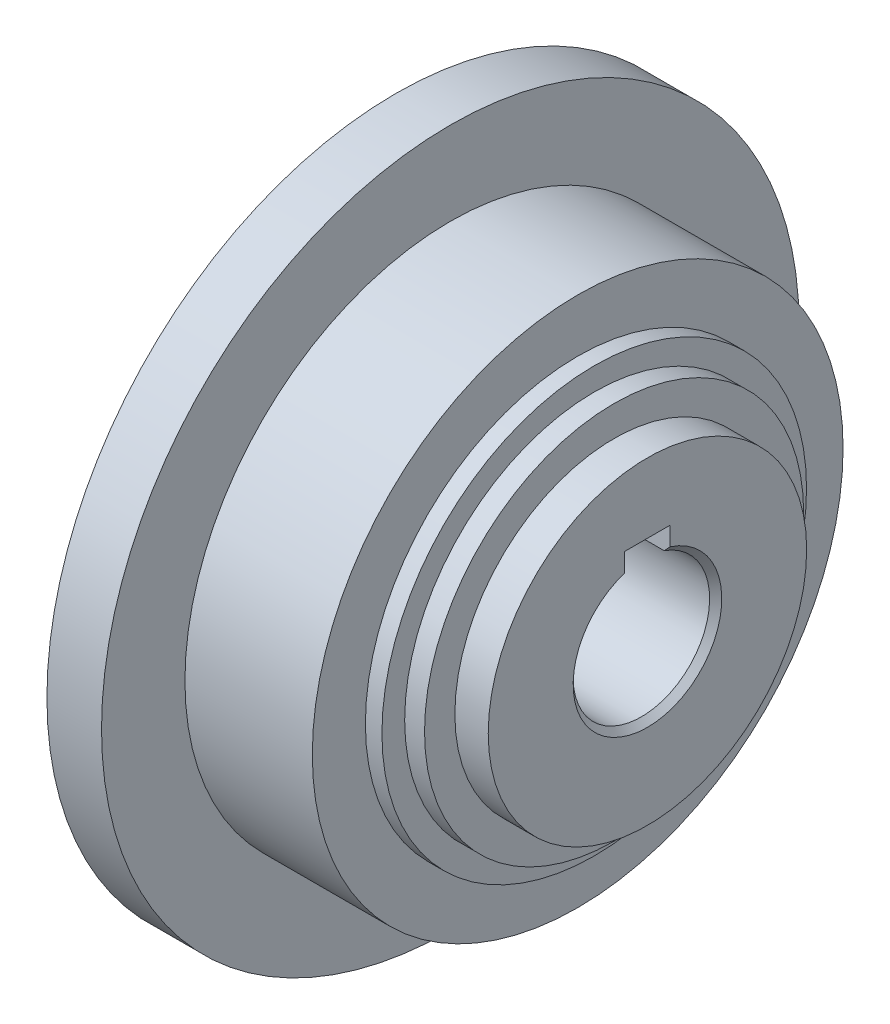
ISO-10303-21;
HEADER;
FILE_DESCRIPTION(('STEP AP214'),'2;1');
FILE_NAME('part.step','',(''),(''),'','','');
FILE_SCHEMA(('AUTOMOTIVE_DESIGN { 1 0 10303 214 1 1 1 1 }'));
ENDSEC;
DATA;
#1=APPLICATION_CONTEXT('core data for automotive mechanical design processes');
#2=APPLICATION_PROTOCOL_DEFINITION('international standard','automotive_design',2000,#1);
#3=PRODUCT_CONTEXT('',#1,'mechanical');
#4=PRODUCT('Part','Part','',(#3));
#5=PRODUCT_RELATED_PRODUCT_CATEGORY('part','',(#4));
#6=PRODUCT_DEFINITION_FORMATION('','',#4);
#7=PRODUCT_DEFINITION_CONTEXT('part definition',#1,'design');
#8=PRODUCT_DEFINITION('design','',#6,#7);
#9=PRODUCT_DEFINITION_SHAPE('','',#8);
#10=(LENGTH_UNIT() NAMED_UNIT(*) SI_UNIT(.MILLI.,.METRE.));
#11=(NAMED_UNIT(*) PLANE_ANGLE_UNIT() SI_UNIT($,.RADIAN.));
#12=(NAMED_UNIT(*) SI_UNIT($,.STERADIAN.) SOLID_ANGLE_UNIT());
#13=UNCERTAINTY_MEASURE_WITH_UNIT(LENGTH_MEASURE(1.E-05),#10,'distance_accuracy_value','');
#14=(GEOMETRIC_REPRESENTATION_CONTEXT(3) GLOBAL_UNCERTAINTY_ASSIGNED_CONTEXT((#13)) GLOBAL_UNIT_ASSIGNED_CONTEXT((#10,
#11,#12)) REPRESENTATION_CONTEXT('',''));
#15=CARTESIAN_POINT('',(0.,0.,0.));
#16=DIRECTION('',(0.,0.,1.));
#17=DIRECTION('',(1.,0.,0.));
#18=AXIS2_PLACEMENT_3D('',#15,#16,#17);
#19=CARTESIAN_POINT('',(-6.16916806791334,0.,0.));
#20=DIRECTION('',(-1.,0.,0.));
#21=DIRECTION('',(0.,0.,1.));
#22=AXIS2_PLACEMENT_3D('',#19,#20,#21);
#23=CYLINDRICAL_SURFACE('',#22,13.9999999999998);
#24=CARTESIAN_POINT('',(15.5000000000017,0.,0.));
#25=DIRECTION('',(-1.,0.,0.));
#26=DIRECTION('',(0.,0.,1.));
#27=AXIS2_PLACEMENT_3D('',#24,#25,#26);
#28=CIRCLE('',#27,13.9999999999998);
#29=CARTESIAN_POINT('',(15.5000000000017,0.,13.9999999999998));
#30=VERTEX_POINT('',#29);
#31=EDGE_CURVE('E207',#30,#30,#28,.F.);
#32=ORIENTED_EDGE('',*,*,#31,.T.);
#33=EDGE_LOOP('',(#32));
#34=FACE_BOUND('',#33,.T.);
#35=CARTESIAN_POINT('',(16.5900000000017,0.,0.));
#36=DIRECTION('',(-1.,0.,0.));
#37=DIRECTION('',(0.,0.,1.));
#38=AXIS2_PLACEMENT_3D('',#35,#36,#37);
#39=CIRCLE('',#38,13.9999999999998);
#40=CARTESIAN_POINT('',(16.5900000000017,0.,13.9999999999998));
#41=VERTEX_POINT('',#40);
#42=EDGE_CURVE('E19',#41,#41,#39,.T.);
#43=ORIENTED_EDGE('',*,*,#42,.T.);
#44=EDGE_LOOP('',(#43));
#45=FACE_BOUND('',#44,.T.);
#46=ADVANCED_FACE('F16',(#34,#45),#23,.T.);
#47=CARTESIAN_POINT('',(16.5900000000017,12.4999999999998,0.));
#48=DIRECTION('',(-1.,0.,0.));
#49=DIRECTION('',(0.,0.,1.));
#50=AXIS2_PLACEMENT_3D('',#47,#48,#49);
#51=PLANE('',#50);
#52=CARTESIAN_POINT('',(16.5900000000017,0.,0.));
#53=DIRECTION('',(-1.,0.,0.));
#54=DIRECTION('',(0.,0.,1.));
#55=AXIS2_PLACEMENT_3D('',#52,#53,#54);
#56=CIRCLE('',#55,12.4999999999998);
#57=CARTESIAN_POINT('',(16.5900000000017,0.,12.4999999999998));
#58=VERTEX_POINT('',#57);
#59=EDGE_CURVE('E203',#58,#58,#56,.F.);
#60=ORIENTED_EDGE('',*,*,#59,.F.);
#61=EDGE_LOOP('',(#60));
#62=FACE_BOUND('',#61,.T.);
#63=ORIENTED_EDGE('',*,*,#42,.F.);
#64=EDGE_LOOP('',(#63));
#65=FACE_BOUND('',#64,.T.);
#66=ADVANCED_FACE('F215',(#62,#65),#51,.F.);
#67=CARTESIAN_POINT('',(15.5000000000017,13.9999999999998,0.));
#68=DIRECTION('',(-1.,0.,0.));
#69=DIRECTION('',(0.,0.,1.));
#70=AXIS2_PLACEMENT_3D('',#67,#68,#69);
#71=PLANE('',#70);
#72=ORIENTED_EDGE('',*,*,#31,.F.);
#73=EDGE_LOOP('',(#72));
#74=FACE_BOUND('',#73,.T.);
#75=CARTESIAN_POINT('',(15.5000000000017,0.,0.));
#76=DIRECTION('',(-1.,0.,0.));
#77=DIRECTION('',(0.,0.,1.));
#78=AXIS2_PLACEMENT_3D('',#75,#76,#77);
#79=CIRCLE('',#78,17.5);
#80=CARTESIAN_POINT('',(15.5000000000017,0.,17.5));
#81=VERTEX_POINT('',#80);
#82=EDGE_CURVE('E200',#81,#81,#79,.T.);
#83=ORIENTED_EDGE('',*,*,#82,.F.);
#84=EDGE_LOOP('',(#83));
#85=FACE_BOUND('',#84,.T.);
#86=ADVANCED_FACE('F217',(#74,#85),#71,.F.);
#87=CARTESIAN_POINT('',(-6.16916806791334,0.,0.));
#88=DIRECTION('',(-1.,0.,0.));
#89=DIRECTION('',(0.,0.,1.));
#90=AXIS2_PLACEMENT_3D('',#87,#88,#89);
#91=CYLINDRICAL_SURFACE('',#90,12.4999999999998);
#92=ORIENTED_EDGE('',*,*,#59,.T.);
#93=EDGE_LOOP('',(#92));
#94=FACE_BOUND('',#93,.T.);
#95=CARTESIAN_POINT('',(17.9000000000017,0.,0.));
#96=DIRECTION('',(-1.,0.,0.));
#97=DIRECTION('',(0.,0.,1.));
#98=AXIS2_PLACEMENT_3D('',#95,#96,#97);
#99=CIRCLE('',#98,12.4999999999998);
#100=CARTESIAN_POINT('',(17.9000000000017,0.,12.4999999999998));
#101=VERTEX_POINT('',#100);
#102=EDGE_CURVE('E198',#101,#101,#99,.T.);
#103=ORIENTED_EDGE('',*,*,#102,.T.);
#104=EDGE_LOOP('',(#103));
#105=FACE_BOUND('',#104,.T.);
#106=ADVANCED_FACE('F224',(#94,#105),#91,.T.);
#107=CARTESIAN_POINT('',(-6.16916806791334,0.,0.));
#108=DIRECTION('',(-1.,0.,0.));
#109=DIRECTION('',(0.,0.,1.));
#110=AXIS2_PLACEMENT_3D('',#107,#108,#109);
#111=CYLINDRICAL_SURFACE('',#110,17.5);
#112=CARTESIAN_POINT('',(7.1000000000016,0.,0.));
#113=DIRECTION('',(-1.,0.,0.));
#114=DIRECTION('',(0.,0.,1.));
#115=AXIS2_PLACEMENT_3D('',#112,#113,#114);
#116=CIRCLE('',#115,17.5);
#117=CARTESIAN_POINT('',(7.1000000000016,0.,17.5));
#118=VERTEX_POINT('',#117);
#119=EDGE_CURVE('E80',#118,#118,#116,.F.);
#120=ORIENTED_EDGE('',*,*,#119,.T.);
#121=EDGE_LOOP('',(#120));
#122=FACE_BOUND('',#121,.T.);
#123=ORIENTED_EDGE('',*,*,#82,.T.);
#124=EDGE_LOOP('',(#123));
#125=FACE_BOUND('',#124,.T.);
#126=ADVANCED_FACE('F195',(#122,#125),#111,.T.);
#127=CARTESIAN_POINT('',(17.9000000000017,10.4999999999998,0.));
#128=DIRECTION('',(-1.,0.,0.));
#129=DIRECTION('',(0.,0.,1.));
#130=AXIS2_PLACEMENT_3D('',#127,#128,#129);
#131=PLANE('',#130);
#132=CARTESIAN_POINT('',(17.9000000000017,0.,0.));
#133=DIRECTION('',(-1.,0.,0.));
#134=DIRECTION('',(0.,0.,1.));
#135=AXIS2_PLACEMENT_3D('',#132,#133,#134);
#136=CIRCLE('',#135,10.4999999999998);
#137=CARTESIAN_POINT('',(17.9000000000017,0.,10.4999999999998));
#138=VERTEX_POINT('',#137);
#139=EDGE_CURVE('E79',#138,#138,#136,.F.);
#140=ORIENTED_EDGE('',*,*,#139,.F.);
#141=EDGE_LOOP('',(#140));
#142=FACE_BOUND('',#141,.T.);
#143=ORIENTED_EDGE('',*,*,#102,.F.);
#144=EDGE_LOOP('',(#143));
#145=FACE_BOUND('',#144,.T.);
#146=ADVANCED_FACE('F192',(#142,#145),#131,.F.);
#147=CARTESIAN_POINT('',(7.1000000000016,17.5,0.));
#148=DIRECTION('',(-1.,0.,0.));
#149=DIRECTION('',(0.,0.,1.));
#150=AXIS2_PLACEMENT_3D('',#147,#148,#149);
#151=PLANE('',#150);
#152=ORIENTED_EDGE('',*,*,#119,.F.);
#153=EDGE_LOOP('',(#152));
#154=FACE_BOUND('',#153,.T.);
#155=CARTESIAN_POINT('',(7.1000000000016,0.,0.));
#156=DIRECTION('',(-1.,0.,0.));
#157=DIRECTION('',(0.,0.,1.));
#158=AXIS2_PLACEMENT_3D('',#155,#156,#157);
#159=CIRCLE('',#158,22.9999999999999);
#160=CARTESIAN_POINT('',(7.1000000000016,0.,22.9999999999999));
#161=VERTEX_POINT('',#160);
#162=EDGE_CURVE('E119',#161,#161,#159,.T.);
#163=ORIENTED_EDGE('',*,*,#162,.F.);
#164=EDGE_LOOP('',(#163));
#165=FACE_BOUND('',#164,.T.);
#166=ADVANCED_FACE('F175',(#154,#165),#151,.F.);
#167=CARTESIAN_POINT('',(20.0999999998999,0.,0.));
#168=DIRECTION('',(1.,0.,0.));
#169=DIRECTION('',(0.,0.,-1.));
#170=AXIS2_PLACEMENT_3D('',#167,#168,#169);
#171=CONICAL_SURFACE('',#170,4.89999999990687,0.785398163397448);
#172=CARTESIAN_POINT('',(19.6999999999985,4.24264068712508,-1.5));
#173=CARTESIAN_POINT('',(19.7664967771654,4.31315515347858,-1.5));
#174=CARTESIAN_POINT('',(19.8330785011562,4.38358912456328,-1.5));
#175=CARTESIAN_POINT('',(19.9664118345133,4.52429606746503,-1.5));
#176=CARTESIAN_POINT('',(20.0331634438584,4.59456903930208,-1.5));
#177=CARTESIAN_POINT('',(20.1000000000064,4.66476151589029,-1.5));
#178=B_SPLINE_CURVE_WITH_KNOTS('',3,(#172,#173,#174,#175,#176,#177),.UNSPECIFIED.,.F.,.F.,(4,2,
4),(0.,0.290769035956677,0.581538035832451),.UNSPECIFIED.);
#179=CARTESIAN_POINT('',(19.7000000000001,4.24264068712218,-1.5));
#180=VERTEX_POINT('',#179);
#181=CARTESIAN_POINT('',(20.10000000001,4.66476151589406,-1.5));
#182=VERTEX_POINT('',#181);
#183=EDGE_CURVE('E68',#180,#182,#178,.T.);
#184=ORIENTED_EDGE('',*,*,#183,.F.);
#185=CARTESIAN_POINT('',(19.7000000000017,0.,0.));
#186=DIRECTION('',(1.,0.,0.));
#187=DIRECTION('',(0.,0.,-1.));
#188=AXIS2_PLACEMENT_3D('',#185,#186,#187);
#189=CIRCLE('',#188,4.5);
#190=CARTESIAN_POINT('',(19.6999999999994,4.24264068712145,1.5));
#191=VERTEX_POINT('',#190);
#192=EDGE_CURVE('E62',#180,#191,#189,.F.);
#193=ORIENTED_EDGE('',*,*,#192,.T.);
#194=CARTESIAN_POINT('',(19.6999999999971,4.24264068712362,1.5));
#195=CARTESIAN_POINT('',(19.7664967771632,4.31315515347628,1.5));
#196=CARTESIAN_POINT('',(19.8330785011533,4.38358912456014,1.5));
#197=CARTESIAN_POINT('',(19.9664118345087,4.52429606746022,1.5));
#198=CARTESIAN_POINT('',(20.033163443853,4.59456903929643,1.5));
#199=CARTESIAN_POINT('',(20.1000000000002,4.66476151588381,1.5));
#200=B_SPLINE_CURVE_WITH_KNOTS('',3,(#194,#195,#196,#197,#198,#199),.UNSPECIFIED.,.F.,.F.,(4,2,
4),(0.,0.290769035953212,0.581538035825515),.UNSPECIFIED.);
#201=CARTESIAN_POINT('',(20.1000000000069,4.66476151589082,1.5));
#202=VERTEX_POINT('',#201);
#203=EDGE_CURVE('E86',#191,#202,#200,.T.);
#204=ORIENTED_EDGE('',*,*,#203,.T.);
#205=CARTESIAN_POINT('',(20.1000000000136,0.,0.));
#206=DIRECTION('',(1.,0.,0.));
#207=DIRECTION('',(0.,0.,-1.));
#208=AXIS2_PLACEMENT_3D('',#205,#206,#207);
#209=CIRCLE('',#208,4.90000000002055);
#210=EDGE_CURVE('E83',#202,#182,#209,.T.);
#211=ORIENTED_EDGE('',*,*,#210,.T.);
#212=EDGE_LOOP('',(#184,#193,#204,#211));
#213=FACE_BOUND('',#212,.T.);
#214=ADVANCED_FACE('F84',(#213),#171,.F.);
#215=CARTESIAN_POINT('',(-6.16916806791334,0.,0.));
#216=DIRECTION('',(-1.,0.,0.));
#217=DIRECTION('',(0.,0.,1.));
#218=AXIS2_PLACEMENT_3D('',#215,#216,#217);
#219=CYLINDRICAL_SURFACE('',#218,10.4999999999998);
#220=ORIENTED_EDGE('',*,*,#139,.T.);
#221=EDGE_LOOP('',(#220));
#222=FACE_BOUND('',#221,.T.);
#223=CARTESIAN_POINT('',(20.1000000000017,0.,0.));
#224=DIRECTION('',(-1.,0.,0.));
#225=DIRECTION('',(0.,0.,1.));
#226=AXIS2_PLACEMENT_3D('',#223,#224,#225);
#227=CIRCLE('',#226,10.4999999999998);
#228=CARTESIAN_POINT('',(20.1000000000017,0.,10.4999999999998));
#229=VERTEX_POINT('',#228);
#230=EDGE_CURVE('E90',#229,#229,#227,.T.);
#231=ORIENTED_EDGE('',*,*,#230,.T.);
#232=EDGE_LOOP('',(#231));
#233=FACE_BOUND('',#232,.T.);
#234=ADVANCED_FACE('F174',(#222,#233),#219,.T.);
#235=CARTESIAN_POINT('',(-6.16916806791334,0.,0.));
#236=DIRECTION('',(-1.,0.,0.));
#237=DIRECTION('',(0.,0.,1.));
#238=AXIS2_PLACEMENT_3D('',#235,#236,#237);
#239=CYLINDRICAL_SURFACE('',#238,22.9999999999999);
#240=CARTESIAN_POINT('',(3.50000000000017,0.,0.));
#241=DIRECTION('',(-1.,0.,0.));
#242=DIRECTION('',(0.,0.,1.));
#243=AXIS2_PLACEMENT_3D('',#240,#241,#242);
#244=CIRCLE('',#243,22.9999999999999);
#245=CARTESIAN_POINT('',(3.50000000000017,0.,22.9999999999999));
#246=VERTEX_POINT('',#245);
#247=EDGE_CURVE('E259',#246,#246,#244,.F.);
#248=ORIENTED_EDGE('',*,*,#247,.T.);
#249=EDGE_LOOP('',(#248));
#250=FACE_BOUND('',#249,.T.);
#251=ORIENTED_EDGE('',*,*,#162,.T.);
#252=EDGE_LOOP('',(#251));
#253=FACE_BOUND('',#252,.T.);
#254=ADVANCED_FACE('F269',(#250,#253),#239,.T.);
#255=CARTESIAN_POINT('',(-0.001000000000001,0.,0.));
#256=DIRECTION('',(1.,0.,0.));
#257=DIRECTION('',(0.,0.,-1.));
#258=AXIS2_PLACEMENT_3D('',#255,#256,#257);
#259=CYLINDRICAL_SURFACE('',#258,4.5);
#260=CARTESIAN_POINT('',(0.400000000070122,0.,0.));
#261=DIRECTION('',(-1.,0.,0.));
#262=DIRECTION('',(0.,0.,1.));
#263=AXIS2_PLACEMENT_3D('',#260,#261,#262);
#264=CIRCLE('',#263,4.50000000000728);
#265=CARTESIAN_POINT('',(0.40000000007376,4.24264068712314,-1.5));
#266=VERTEX_POINT('',#265);
#267=CARTESIAN_POINT('',(0.400000000071309,4.24264068712574,1.5));
#268=VERTEX_POINT('',#267);
#269=EDGE_CURVE('E114',#266,#268,#264,.T.);
#270=ORIENTED_EDGE('',*,*,#269,.T.);
#271=DIRECTION('',(1.,0.,0.));
#272=VECTOR('',#271,1.);
#273=CARTESIAN_POINT('',(-0.001000000000001,4.24264068711928,1.5));
#274=LINE('',#273,#272);
#275=EDGE_CURVE('E118',#268,#191,#274,.T.);
#276=ORIENTED_EDGE('',*,*,#275,.T.);
#277=ORIENTED_EDGE('',*,*,#192,.F.);
#278=DIRECTION('',(1.,0.,0.));
#279=VECTOR('',#278,1.);
#280=CARTESIAN_POINT('',(-0.001000000000001,4.24264068711928,-1.5));
#281=LINE('',#280,#279);
#282=EDGE_CURVE('E77',#180,#266,#281,.F.);
#283=ORIENTED_EDGE('',*,*,#282,.T.);
#284=EDGE_LOOP('',(#270,#276,#277,#283));
#285=FACE_BOUND('',#284,.T.);
#286=ADVANCED_FACE('F247',(#285),#259,.F.);
#287=CARTESIAN_POINT('',(-0.001000000000001,5.9,1.5));
#288=DIRECTION('',(0.,0.,1.));
#289=DIRECTION('',(0.,-1.,0.));
#290=AXIS2_PLACEMENT_3D('',#287,#288,#289);
#291=PLANE('',#290);
#292=DIRECTION('',(1.,0.,0.));
#293=VECTOR('',#292,1.);
#294=CARTESIAN_POINT('',(-0.001000000000001,5.9,1.5));
#295=LINE('',#294,#293);
#296=CARTESIAN_POINT('',(0.,5.9,1.5));
#297=VERTEX_POINT('',#296);
#298=CARTESIAN_POINT('',(20.1000000000017,5.9,1.5));
#299=VERTEX_POINT('',#298);
#300=EDGE_CURVE('E110',#297,#299,#295,.T.);
#301=ORIENTED_EDGE('',*,*,#300,.T.);
#302=DIRECTION('',(0.,1.,0.));
#303=VECTOR('',#302,1.);
#304=CARTESIAN_POINT('',(20.1000000000017,0.,1.5));
#305=LINE('',#304,#303);
#306=EDGE_CURVE('E91',#299,#202,#305,.F.);
#307=ORIENTED_EDGE('',*,*,#306,.T.);
#308=ORIENTED_EDGE('',*,*,#203,.F.);
#309=ORIENTED_EDGE('',*,*,#275,.F.);
#310=CARTESIAN_POINT('',(0.400000000062497,4.24264068712964,1.49999999999524));
#311=CARTESIAN_POINT('',(0.333503222890513,4.31315515349123,1.49999999999762));
#312=CARTESIAN_POINT('',(0.266921498894123,4.38358912458357,1.49999999999921));
#313=CARTESIAN_POINT('',(0.133588165525055,4.52429606749973,1.50000000000079));
#314=CARTESIAN_POINT('',(0.0668365561734599,4.59456903934354,1.50000000000079));
#315=CARTESIAN_POINT('',(1.85402489629483E-11,4.66476151593807,1.5));
#316=B_SPLINE_CURVE_WITH_KNOTS('',3,(#310,#311,#312,#313,#314,#315),.UNSPECIFIED.,.F.,.F.,(4,2,
4),(0.,0.290769035984772,0.581538035888632),.UNSPECIFIED.);
#317=CARTESIAN_POINT('',(9.26085505166191E-12,4.66476151594781,1.5));
#318=VERTEX_POINT('',#317);
#319=EDGE_CURVE('E127',#268,#318,#316,.T.);
#320=ORIENTED_EDGE('',*,*,#319,.T.);
#321=DIRECTION('',(0.,-1.,0.));
#322=VECTOR('',#321,1.);
#323=CARTESIAN_POINT('',(0.,5.9,1.5));
#324=LINE('',#323,#322);
#325=EDGE_CURVE('E34',#297,#318,#324,.T.);
#326=ORIENTED_EDGE('',*,*,#325,.F.);
#327=EDGE_LOOP('',(#301,#307,#308,#309,#320,#326));
#328=FACE_BOUND('',#327,.T.);
#329=ADVANCED_FACE('F142',(#328),#291,.F.);
#330=CARTESIAN_POINT('',(20.1000000000017,0.,0.));
#331=DIRECTION('',(-1.,0.,0.));
#332=DIRECTION('',(0.,0.,1.));
#333=AXIS2_PLACEMENT_3D('',#330,#331,#332);
#334=PLANE('',#333);
#335=ORIENTED_EDGE('',*,*,#230,.F.);
#336=EDGE_LOOP('',(#335));
#337=FACE_BOUND('',#336,.T.);
#338=ORIENTED_EDGE('',*,*,#210,.F.);
#339=ORIENTED_EDGE('',*,*,#306,.F.);
#340=DIRECTION('',(0.,0.,1.));
#341=VECTOR('',#340,1.);
#342=CARTESIAN_POINT('',(20.1000000000017,5.9,1.5));
#343=LINE('',#342,#341);
#344=CARTESIAN_POINT('',(20.1000000000017,5.9,-1.5));
#345=VERTEX_POINT('',#344);
#346=EDGE_CURVE('E96',#299,#345,#343,.F.);
#347=ORIENTED_EDGE('',*,*,#346,.T.);
#348=DIRECTION('',(0.,1.,0.));
#349=VECTOR('',#348,1.);
#350=CARTESIAN_POINT('',(20.1000000000017,5.9,-1.5));
#351=LINE('',#350,#349);
#352=EDGE_CURVE('E75',#345,#182,#351,.F.);
#353=ORIENTED_EDGE('',*,*,#352,.T.);
#354=EDGE_LOOP('',(#338,#339,#347,#353));
#355=FACE_BOUND('',#354,.T.);
#356=ADVANCED_FACE('F94',(#337,#355),#334,.F.);
#357=CARTESIAN_POINT('',(-0.001000000000001,5.9,-1.5));
#358=DIRECTION('',(0.,0.,-1.));
#359=DIRECTION('',(0.,1.,0.));
#360=AXIS2_PLACEMENT_3D('',#357,#358,#359);
#361=PLANE('',#360);
#362=CARTESIAN_POINT('',(1.4616003547471E-11,4.66476151593437,-1.49999999999328));
#363=CARTESIAN_POINT('',(0.0668365561706934,4.59456903934163,-1.49999999999664));
#364=CARTESIAN_POINT('',(0.133588165523249,4.52429606749943,-1.49999999999888));
#365=CARTESIAN_POINT('',(0.266921498893839,4.38358912458608,-1.50000000000112));
#366=CARTESIAN_POINT('',(0.333503222890792,4.31315515349497,-1.50000000000112));
#367=CARTESIAN_POINT('',(0.400000000063141,4.24264068713441,-1.5));
#368=B_SPLINE_CURVE_WITH_KNOTS('',3,(#362,#363,#364,#365,#366,#367),.UNSPECIFIED.,.F.,.F.,(4,2,
4),(0.,0.290768999902363,0.581538035885628),.UNSPECIFIED.);
#369=CARTESIAN_POINT('',(9.26091853725144E-12,4.66476151594781,-1.5));
#370=VERTEX_POINT('',#369);
#371=EDGE_CURVE('E135',#370,#266,#368,.T.);
#372=ORIENTED_EDGE('',*,*,#371,.T.);
#373=ORIENTED_EDGE('',*,*,#282,.F.);
#374=ORIENTED_EDGE('',*,*,#183,.T.);
#375=ORIENTED_EDGE('',*,*,#352,.F.);
#376=DIRECTION('',(1.,0.,0.));
#377=VECTOR('',#376,1.);
#378=CARTESIAN_POINT('',(-0.001000000000001,5.9,-1.5));
#379=LINE('',#378,#377);
#380=CARTESIAN_POINT('',(0.,5.9,-1.5));
#381=VERTEX_POINT('',#380);
#382=EDGE_CURVE('E109',#345,#381,#379,.F.);
#383=ORIENTED_EDGE('',*,*,#382,.T.);
#384=DIRECTION('',(0.,1.,0.));
#385=VECTOR('',#384,1.);
#386=CARTESIAN_POINT('',(0.,5.9,-1.5));
#387=LINE('',#386,#385);
#388=EDGE_CURVE('E98',#370,#381,#387,.T.);
#389=ORIENTED_EDGE('',*,*,#388,.F.);
#390=EDGE_LOOP('',(#372,#373,#374,#375,#383,#389));
#391=FACE_BOUND('',#390,.T.);
#392=ADVANCED_FACE('F71',(#391),#361,.F.);
#393=CARTESIAN_POINT('',(3.50000000000017,22.9999999999999,0.));
#394=DIRECTION('',(1.,0.,0.));
#395=DIRECTION('',(0.,0.,-1.));
#396=AXIS2_PLACEMENT_3D('',#393,#394,#395);
#397=PLANE('',#396);
#398=ORIENTED_EDGE('',*,*,#247,.F.);
#399=EDGE_LOOP('',(#398));
#400=FACE_BOUND('',#399,.T.);
#401=CARTESIAN_POINT('',(3.50000000000017,0.,0.));
#402=DIRECTION('',(-1.,0.,0.));
#403=DIRECTION('',(0.,0.,1.));
#404=AXIS2_PLACEMENT_3D('',#401,#402,#403);
#405=CIRCLE('',#404,17.9999999999999);
#406=CARTESIAN_POINT('',(3.50000000000017,0.,17.9999999999999));
#407=VERTEX_POINT('',#406);
#408=EDGE_CURVE('E124',#407,#407,#405,.T.);
#409=ORIENTED_EDGE('',*,*,#408,.F.);
#410=EDGE_LOOP('',(#409));
#411=FACE_BOUND('',#410,.T.);
#412=ADVANCED_FACE('F152',(#400,#411),#397,.F.);
#413=CARTESIAN_POINT('',(0.,0.,0.));
#414=DIRECTION('',(-1.,0.,0.));
#415=DIRECTION('',(0.,0.,1.));
#416=AXIS2_PLACEMENT_3D('',#413,#414,#415);
#417=CONICAL_SURFACE('',#416,4.9000000000774,0.785398163397448);
#418=ORIENTED_EDGE('',*,*,#269,.F.);
#419=ORIENTED_EDGE('',*,*,#371,.F.);
#420=CARTESIAN_POINT('',(0.,0.,0.));
#421=DIRECTION('',(-1.,0.,0.));
#422=DIRECTION('',(0.,0.,1.));
#423=AXIS2_PLACEMENT_3D('',#420,#421,#422);
#424=CIRCLE('',#423,4.9000000000774);
#425=EDGE_CURVE('E122',#370,#318,#424,.T.);
#426=ORIENTED_EDGE('',*,*,#425,.T.);
#427=ORIENTED_EDGE('',*,*,#319,.F.);
#428=EDGE_LOOP('',(#418,#419,#426,#427));
#429=FACE_BOUND('',#428,.T.);
#430=ADVANCED_FACE('F146',(#429),#417,.F.);
#431=CARTESIAN_POINT('',(-0.001000000000001,5.9,1.5));
#432=DIRECTION('',(0.,1.,0.));
#433=DIRECTION('',(0.,0.,1.));
#434=AXIS2_PLACEMENT_3D('',#431,#432,#433);
#435=PLANE('',#434);
#436=ORIENTED_EDGE('',*,*,#382,.F.);
#437=ORIENTED_EDGE('',*,*,#346,.F.);
#438=ORIENTED_EDGE('',*,*,#300,.F.);
#439=DIRECTION('',(0.,0.,-1.));
#440=VECTOR('',#439,1.);
#441=CARTESIAN_POINT('',(0.,5.9,0.));
#442=LINE('',#441,#440);
#443=EDGE_CURVE('E25',#297,#381,#442,.T.);
#444=ORIENTED_EDGE('',*,*,#443,.T.);
#445=EDGE_LOOP('',(#436,#437,#438,#444));
#446=FACE_BOUND('',#445,.T.);
#447=ADVANCED_FACE('F151',(#446),#435,.F.);
#448=CARTESIAN_POINT('',(-6.16916806791334,0.,0.));
#449=DIRECTION('',(-1.,0.,0.));
#450=DIRECTION('',(0.,0.,1.));
#451=AXIS2_PLACEMENT_3D('',#448,#449,#450);
#452=CYLINDRICAL_SURFACE('',#451,17.9999999999999);
#453=CARTESIAN_POINT('',(0.,0.,0.));
#454=DIRECTION('',(-1.,0.,0.));
#455=DIRECTION('',(0.,0.,1.));
#456=AXIS2_PLACEMENT_3D('',#453,#454,#455);
#457=CIRCLE('',#456,17.9999999999999);
#458=CARTESIAN_POINT('',(0.,0.,17.9999999999999));
#459=VERTEX_POINT('',#458);
#460=EDGE_CURVE('E11',#459,#459,#457,.F.);
#461=ORIENTED_EDGE('',*,*,#460,.T.);
#462=EDGE_LOOP('',(#461));
#463=FACE_BOUND('',#462,.T.);
#464=ORIENTED_EDGE('',*,*,#408,.T.);
#465=EDGE_LOOP('',(#464));
#466=FACE_BOUND('',#465,.T.);
#467=ADVANCED_FACE('F230',(#463,#466),#452,.T.);
#468=CARTESIAN_POINT('',(0.,17.9999999999999,0.));
#469=DIRECTION('',(1.,0.,0.));
#470=DIRECTION('',(0.,0.,-1.));
#471=AXIS2_PLACEMENT_3D('',#468,#469,#470);
#472=PLANE('',#471);
#473=ORIENTED_EDGE('',*,*,#460,.F.);
#474=EDGE_LOOP('',(#473));
#475=FACE_BOUND('',#474,.T.);
#476=ORIENTED_EDGE('',*,*,#325,.T.);
#477=ORIENTED_EDGE('',*,*,#425,.F.);
#478=ORIENTED_EDGE('',*,*,#388,.T.);
#479=ORIENTED_EDGE('',*,*,#443,.F.);
#480=EDGE_LOOP('',(#476,#477,#478,#479));
#481=FACE_BOUND('',#480,.T.);
#482=ADVANCED_FACE('F228',(#475,#481),#472,.F.);
#483=CLOSED_SHELL('',(#46,#66,#86,#106,#126,#146,#166,#214,#234,#254,#286,#329,#356,#392,#412,
#430,#447,#467,#482));
#484=MANIFOLD_SOLID_BREP('B1',#483);
#485=ADVANCED_BREP_SHAPE_REPRESENTATION('',(#18,#484),#14);
#486=SHAPE_DEFINITION_REPRESENTATION(#9,#485);
ENDSEC;
END-ISO-10303-21;
